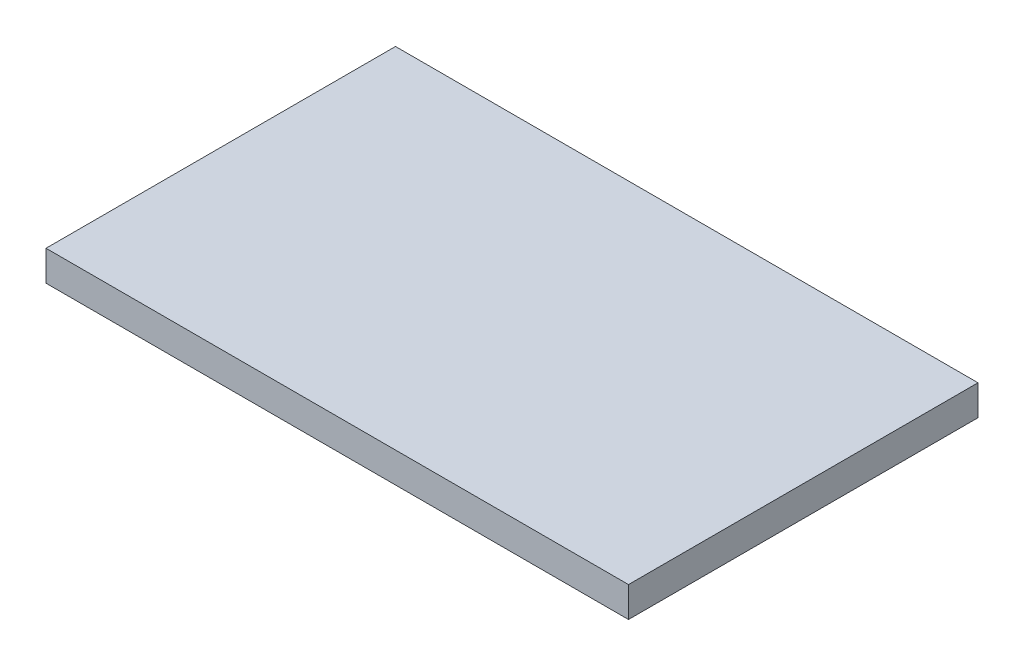
ISO-10303-21;
HEADER;
FILE_DESCRIPTION(('STEP AP214'),'2;1');
FILE_NAME('part.step','',(''),(''),'','','');
FILE_SCHEMA(('AUTOMOTIVE_DESIGN { 1 0 10303 214 1 1 1 1 }'));
ENDSEC;
DATA;
#1=APPLICATION_CONTEXT('core data for automotive mechanical design processes');
#2=APPLICATION_PROTOCOL_DEFINITION('international standard','automotive_design',2000,#1);
#3=PRODUCT_CONTEXT('',#1,'mechanical');
#4=PRODUCT('Part','Part','',(#3));
#5=PRODUCT_RELATED_PRODUCT_CATEGORY('part','',(#4));
#6=PRODUCT_DEFINITION_FORMATION('','',#4);
#7=PRODUCT_DEFINITION_CONTEXT('part definition',#1,'design');
#8=PRODUCT_DEFINITION('design','',#6,#7);
#9=PRODUCT_DEFINITION_SHAPE('','',#8);
#10=(LENGTH_UNIT() NAMED_UNIT(*) SI_UNIT(.MILLI.,.METRE.));
#11=(NAMED_UNIT(*) PLANE_ANGLE_UNIT() SI_UNIT($,.RADIAN.));
#12=(NAMED_UNIT(*) SI_UNIT($,.STERADIAN.) SOLID_ANGLE_UNIT());
#13=UNCERTAINTY_MEASURE_WITH_UNIT(LENGTH_MEASURE(1.E-05),#10,'distance_accuracy_value','');
#14=(GEOMETRIC_REPRESENTATION_CONTEXT(3) GLOBAL_UNCERTAINTY_ASSIGNED_CONTEXT((#13)) GLOBAL_UNIT_ASSIGNED_CONTEXT((#10,
#11,#12)) REPRESENTATION_CONTEXT('',''));
#15=CARTESIAN_POINT('',(0.,0.,0.));
#16=DIRECTION('',(0.,0.,1.));
#17=DIRECTION('',(1.,0.,0.));
#18=AXIS2_PLACEMENT_3D('',#15,#16,#17);
#19=CARTESIAN_POINT('',(12.5,1.3,-7.5));
#20=DIRECTION('',(-1.,0.,0.));
#21=DIRECTION('',(0.,0.,1.));
#22=AXIS2_PLACEMENT_3D('',#19,#20,#21);
#23=PLANE('',#22);
#24=DIRECTION('',(0.,0.,-1.));
#25=VECTOR('',#24,1.);
#26=CARTESIAN_POINT('',(12.5,0.,-7.5));
#27=LINE('',#26,#25);
#28=CARTESIAN_POINT('',(12.5,0.,7.5));
#29=VERTEX_POINT('',#28);
#30=CARTESIAN_POINT('',(12.5,0.,-7.5));
#31=VERTEX_POINT('',#30);
#32=EDGE_CURVE('E100',#29,#31,#27,.T.);
#33=ORIENTED_EDGE('',*,*,#32,.T.);
#34=DIRECTION('',(0.,-1.,0.));
#35=VECTOR('',#34,1.);
#36=CARTESIAN_POINT('',(12.5,1.3,-7.5));
#37=LINE('',#36,#35);
#38=CARTESIAN_POINT('',(12.5,1.3,-7.5));
#39=VERTEX_POINT('',#38);
#40=EDGE_CURVE('E11',#39,#31,#37,.T.);
#41=ORIENTED_EDGE('',*,*,#40,.F.);
#42=DIRECTION('',(0.,0.,-1.));
#43=VECTOR('',#42,1.);
#44=CARTESIAN_POINT('',(12.5,1.3,-7.5));
#45=LINE('',#44,#43);
#46=CARTESIAN_POINT('',(12.5,1.3,7.5));
#47=VERTEX_POINT('',#46);
#48=EDGE_CURVE('E88',#47,#39,#45,.T.);
#49=ORIENTED_EDGE('',*,*,#48,.F.);
#50=DIRECTION('',(0.,-1.,0.));
#51=VECTOR('',#50,1.);
#52=CARTESIAN_POINT('',(12.5,1.3,7.5));
#53=LINE('',#52,#51);
#54=EDGE_CURVE('E96',#47,#29,#53,.T.);
#55=ORIENTED_EDGE('',*,*,#54,.T.);
#56=EDGE_LOOP('',(#33,#41,#49,#55));
#57=FACE_BOUND('',#56,.T.);
#58=ADVANCED_FACE('F37',(#57),#23,.F.);
#59=CARTESIAN_POINT('',(-12.5,1.3,-7.5));
#60=DIRECTION('',(0.,0.,1.));
#61=DIRECTION('',(1.,0.,0.));
#62=AXIS2_PLACEMENT_3D('',#59,#60,#61);
#63=PLANE('',#62);
#64=DIRECTION('',(-1.,0.,0.));
#65=VECTOR('',#64,1.);
#66=CARTESIAN_POINT('',(-12.5,0.,-7.5));
#67=LINE('',#66,#65);
#68=CARTESIAN_POINT('',(-12.5,0.,-7.5));
#69=VERTEX_POINT('',#68);
#70=EDGE_CURVE('E92',#31,#69,#67,.T.);
#71=ORIENTED_EDGE('',*,*,#70,.T.);
#72=DIRECTION('',(0.,-1.,0.));
#73=VECTOR('',#72,1.);
#74=CARTESIAN_POINT('',(-12.5,1.3,-7.5));
#75=LINE('',#74,#73);
#76=CARTESIAN_POINT('',(-12.5,1.3,-7.5));
#77=VERTEX_POINT('',#76);
#78=EDGE_CURVE('E45',#77,#69,#75,.T.);
#79=ORIENTED_EDGE('',*,*,#78,.F.);
#80=DIRECTION('',(-1.,0.,0.));
#81=VECTOR('',#80,1.);
#82=CARTESIAN_POINT('',(-12.5,1.3,-7.5));
#83=LINE('',#82,#81);
#84=EDGE_CURVE('E83',#39,#77,#83,.T.);
#85=ORIENTED_EDGE('',*,*,#84,.F.);
#86=ORIENTED_EDGE('',*,*,#40,.T.);
#87=EDGE_LOOP('',(#71,#79,#85,#86));
#88=FACE_BOUND('',#87,.T.);
#89=ADVANCED_FACE('F91',(#88),#63,.F.);
#90=CARTESIAN_POINT('',(-12.5,1.3,-7.5));
#91=DIRECTION('',(1.,0.,0.));
#92=DIRECTION('',(0.,0.,-1.));
#93=AXIS2_PLACEMENT_3D('',#90,#91,#92);
#94=PLANE('',#93);
#95=DIRECTION('',(0.,0.,1.));
#96=VECTOR('',#95,1.);
#97=CARTESIAN_POINT('',(-12.5,0.,-7.5));
#98=LINE('',#97,#96);
#99=CARTESIAN_POINT('',(-12.5,0.,7.5));
#100=VERTEX_POINT('',#99);
#101=EDGE_CURVE('E70',#69,#100,#98,.T.);
#102=ORIENTED_EDGE('',*,*,#101,.T.);
#103=DIRECTION('',(0.,-1.,0.));
#104=VECTOR('',#103,1.);
#105=CARTESIAN_POINT('',(-12.5,1.3,7.5));
#106=LINE('',#105,#104);
#107=CARTESIAN_POINT('',(-12.5,1.3,7.5));
#108=VERTEX_POINT('',#107);
#109=EDGE_CURVE('E93',#108,#100,#106,.T.);
#110=ORIENTED_EDGE('',*,*,#109,.F.);
#111=DIRECTION('',(0.,0.,1.));
#112=VECTOR('',#111,1.);
#113=CARTESIAN_POINT('',(-12.5,1.3,-7.5));
#114=LINE('',#113,#112);
#115=EDGE_CURVE('E86',#77,#108,#114,.T.);
#116=ORIENTED_EDGE('',*,*,#115,.F.);
#117=ORIENTED_EDGE('',*,*,#78,.T.);
#118=EDGE_LOOP('',(#102,#110,#116,#117));
#119=FACE_BOUND('',#118,.T.);
#120=ADVANCED_FACE('F94',(#119),#94,.F.);
#121=CARTESIAN_POINT('',(-12.5,1.3,7.5));
#122=DIRECTION('',(0.,0.,-1.));
#123=DIRECTION('',(-1.,0.,0.));
#124=AXIS2_PLACEMENT_3D('',#121,#122,#123);
#125=PLANE('',#124);
#126=DIRECTION('',(1.,0.,0.));
#127=VECTOR('',#126,1.);
#128=CARTESIAN_POINT('',(-12.5,0.,7.5));
#129=LINE('',#128,#127);
#130=EDGE_CURVE('E76',#100,#29,#129,.T.);
#131=ORIENTED_EDGE('',*,*,#130,.T.);
#132=ORIENTED_EDGE('',*,*,#54,.F.);
#133=DIRECTION('',(1.,0.,0.));
#134=VECTOR('',#133,1.);
#135=CARTESIAN_POINT('',(-12.5,1.3,7.5));
#136=LINE('',#135,#134);
#137=EDGE_CURVE('E53',#108,#47,#136,.T.);
#138=ORIENTED_EDGE('',*,*,#137,.F.);
#139=ORIENTED_EDGE('',*,*,#109,.T.);
#140=EDGE_LOOP('',(#131,#132,#138,#139));
#141=FACE_BOUND('',#140,.T.);
#142=ADVANCED_FACE('F107',(#141),#125,.F.);
#143=CARTESIAN_POINT('',(0.,1.3,0.));
#144=DIRECTION('',(0.,1.,0.));
#145=DIRECTION('',(0.,0.,1.));
#146=AXIS2_PLACEMENT_3D('',#143,#144,#145);
#147=PLANE('',#146);
#148=ORIENTED_EDGE('',*,*,#48,.T.);
#149=ORIENTED_EDGE('',*,*,#84,.T.);
#150=ORIENTED_EDGE('',*,*,#115,.T.);
#151=ORIENTED_EDGE('',*,*,#137,.T.);
#152=EDGE_LOOP('',(#148,#149,#150,#151));
#153=FACE_BOUND('',#152,.T.);
#154=ADVANCED_FACE('F84',(#153),#147,.T.);
#155=CARTESIAN_POINT('',(0.,0.,0.));
#156=DIRECTION('',(0.,1.,0.));
#157=DIRECTION('',(0.,0.,1.));
#158=AXIS2_PLACEMENT_3D('',#155,#156,#157);
#159=PLANE('',#158);
#160=ORIENTED_EDGE('',*,*,#32,.F.);
#161=ORIENTED_EDGE('',*,*,#130,.F.);
#162=ORIENTED_EDGE('',*,*,#101,.F.);
#163=ORIENTED_EDGE('',*,*,#70,.F.);
#164=EDGE_LOOP('',(#160,#161,#162,#163));
#165=FACE_BOUND('',#164,.T.);
#166=ADVANCED_FACE('F110',(#165),#159,.F.);
#167=CLOSED_SHELL('',(#58,#89,#120,#142,#154,#166));
#168=MANIFOLD_SOLID_BREP('B2',#167);
#169=ADVANCED_BREP_SHAPE_REPRESENTATION('',(#18,#168),#14);
#170=SHAPE_DEFINITION_REPRESENTATION(#9,#169);
ENDSEC;
END-ISO-10303-21;
